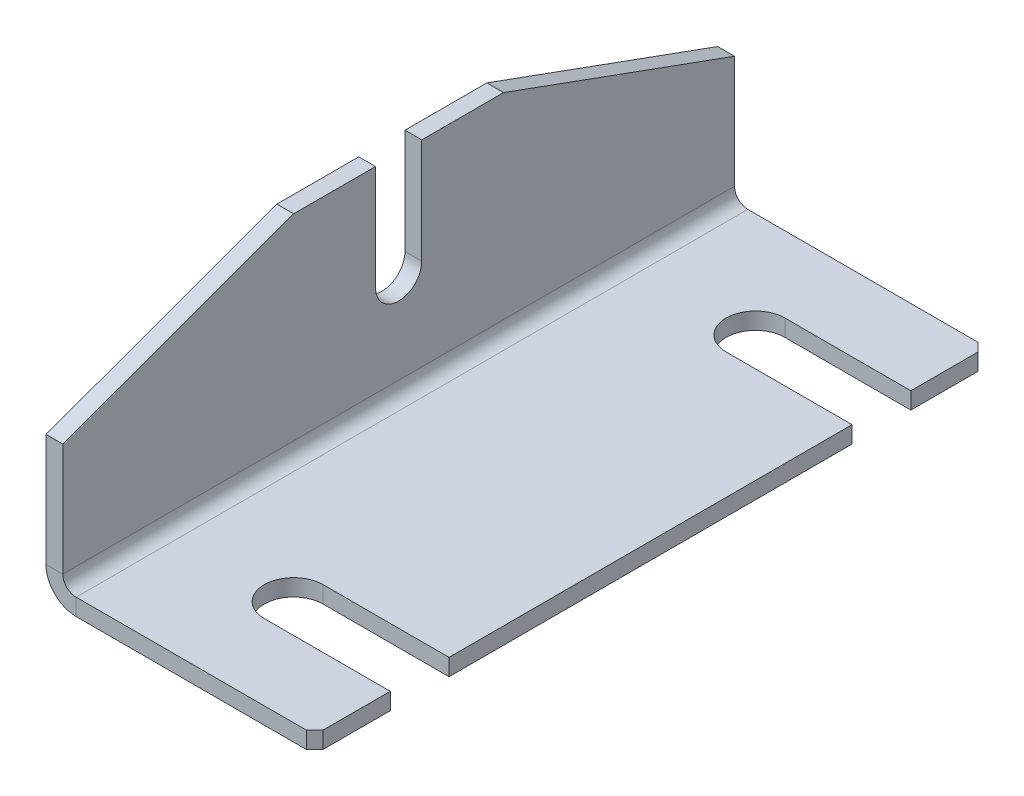
ISO-10303-21;
HEADER;
FILE_DESCRIPTION(('STEP AP214'),'2;1');
FILE_NAME('part.step','',(''),(''),'','','');
FILE_SCHEMA(('AUTOMOTIVE_DESIGN { 1 0 10303 214 1 1 1 1 }'));
ENDSEC;
DATA;
#1=APPLICATION_CONTEXT('core data for automotive mechanical design processes');
#2=APPLICATION_PROTOCOL_DEFINITION('international standard','automotive_design',2000,#1);
#3=PRODUCT_CONTEXT('',#1,'mechanical');
#4=PRODUCT('Part','Part','',(#3));
#5=PRODUCT_RELATED_PRODUCT_CATEGORY('part','',(#4));
#6=PRODUCT_DEFINITION_FORMATION('','',#4);
#7=PRODUCT_DEFINITION_CONTEXT('part definition',#1,'design');
#8=PRODUCT_DEFINITION('design','',#6,#7);
#9=PRODUCT_DEFINITION_SHAPE('','',#8);
#10=(LENGTH_UNIT() NAMED_UNIT(*) SI_UNIT(.MILLI.,.METRE.));
#11=(NAMED_UNIT(*) PLANE_ANGLE_UNIT() SI_UNIT($,.RADIAN.));
#12=(NAMED_UNIT(*) SI_UNIT($,.STERADIAN.) SOLID_ANGLE_UNIT());
#13=UNCERTAINTY_MEASURE_WITH_UNIT(LENGTH_MEASURE(1.E-05),#10,'distance_accuracy_value','');
#14=(GEOMETRIC_REPRESENTATION_CONTEXT(3) GLOBAL_UNCERTAINTY_ASSIGNED_CONTEXT((#13)) GLOBAL_UNIT_ASSIGNED_CONTEXT((#10,
#11,#12)) REPRESENTATION_CONTEXT('',''));
#15=CARTESIAN_POINT('',(0.,0.,0.));
#16=DIRECTION('',(0.,0.,1.));
#17=DIRECTION('',(1.,0.,0.));
#18=AXIS2_PLACEMENT_3D('',#15,#16,#17);
#19=CARTESIAN_POINT('',(60.,0.,80.));
#20=DIRECTION('',(1.,0.,0.));
#21=DIRECTION('',(0.,0.,-1.));
#22=AXIS2_PLACEMENT_3D('',#19,#20,#21);
#23=PLANE('',#22);
#24=DIRECTION('',(0.,0.,-1.));
#25=VECTOR('',#24,1.);
#26=CARTESIAN_POINT('',(60.,-4.,80.));
#27=LINE('',#26,#25);
#28=CARTESIAN_POINT('',(60.,-4.,-62.));
#29=VERTEX_POINT('',#28);
#30=CARTESIAN_POINT('',(60.,-4.,-78.));
#31=VERTEX_POINT('',#30);
#32=EDGE_CURVE('E359',#29,#31,#27,.T.);
#33=ORIENTED_EDGE('',*,*,#32,.T.);
#34=DIRECTION('',(0.,1.,0.));
#35=VECTOR('',#34,1.);
#36=CARTESIAN_POINT('',(60.,0.,-78.));
#37=LINE('',#36,#35);
#38=CARTESIAN_POINT('',(60.,0.,-78.));
#39=VERTEX_POINT('',#38);
#40=EDGE_CURVE('E381',#31,#39,#37,.T.);
#41=ORIENTED_EDGE('',*,*,#40,.T.);
#42=DIRECTION('',(0.,0.,-1.));
#43=VECTOR('',#42,1.);
#44=CARTESIAN_POINT('',(60.,0.,80.));
#45=LINE('',#44,#43);
#46=CARTESIAN_POINT('',(60.,0.,-62.));
#47=VERTEX_POINT('',#46);
#48=EDGE_CURVE('E356',#47,#39,#45,.T.);
#49=ORIENTED_EDGE('',*,*,#48,.F.);
#50=DIRECTION('',(0.,1.,0.));
#51=VECTOR('',#50,1.);
#52=CARTESIAN_POINT('',(60.,-4.001,-62.));
#53=LINE('',#52,#51);
#54=EDGE_CURVE('E240',#29,#47,#53,.T.);
#55=ORIENTED_EDGE('',*,*,#54,.F.);
#56=EDGE_LOOP('',(#33,#41,#49,#55));
#57=FACE_BOUND('',#56,.T.);
#58=ADVANCED_FACE('F38',(#57),#23,.T.);
#59=DIRECTION('',(0.,1.,0.));
#60=VECTOR('',#59,1.);
#61=CARTESIAN_POINT('',(60.,-4.001,-48.));
#62=LINE('',#61,#60);
#63=CARTESIAN_POINT('',(60.,-4.,-48.));
#64=VERTEX_POINT('',#63);
#65=CARTESIAN_POINT('',(60.,0.,-48.));
#66=VERTEX_POINT('',#65);
#67=EDGE_CURVE('E210',#64,#66,#62,.T.);
#68=ORIENTED_EDGE('',*,*,#67,.T.);
#69=CARTESIAN_POINT('',(60.,0.,48.));
#70=VERTEX_POINT('',#69);
#71=EDGE_CURVE('E360',#70,#66,#45,.T.);
#72=ORIENTED_EDGE('',*,*,#71,.F.);
#73=DIRECTION('',(0.,1.,0.));
#74=VECTOR('',#73,1.);
#75=CARTESIAN_POINT('',(60.,-4.001,48.));
#76=LINE('',#75,#74);
#77=CARTESIAN_POINT('',(60.,-4.,48.));
#78=VERTEX_POINT('',#77);
#79=EDGE_CURVE('E258',#78,#70,#76,.T.);
#80=ORIENTED_EDGE('',*,*,#79,.F.);
#81=EDGE_CURVE('E364',#78,#64,#27,.T.);
#82=ORIENTED_EDGE('',*,*,#81,.T.);
#83=EDGE_LOOP('',(#68,#72,#80,#82));
#84=FACE_BOUND('',#83,.T.);
#85=ADVANCED_FACE('F411',(#84),#23,.T.);
#86=CARTESIAN_POINT('',(-4.,50.,80.));
#87=DIRECTION('',(0.,1.,0.));
#88=DIRECTION('',(0.,0.,1.));
#89=AXIS2_PLACEMENT_3D('',#86,#87,#88);
#90=PLANE('',#89);
#91=DIRECTION('',(1.,0.,0.));
#92=VECTOR('',#91,1.);
#93=CARTESIAN_POINT('',(-4.001,50.,25.));
#94=LINE('',#93,#92);
#95=CARTESIAN_POINT('',(-4.,50.,25.));
#96=VERTEX_POINT('',#95);
#97=CARTESIAN_POINT('',(0.,50.,25.));
#98=VERTEX_POINT('',#97);
#99=EDGE_CURVE('E269',#96,#98,#94,.T.);
#100=ORIENTED_EDGE('',*,*,#99,.T.);
#101=DIRECTION('',(0.,0.,-1.));
#102=VECTOR('',#101,1.);
#103=CARTESIAN_POINT('',(0.,50.,80.));
#104=LINE('',#103,#102);
#105=CARTESIAN_POINT('',(0.,50.,5.50000000000001));
#106=VERTEX_POINT('',#105);
#107=EDGE_CURVE('E348',#98,#106,#104,.T.);
#108=ORIENTED_EDGE('',*,*,#107,.T.);
#109=DIRECTION('',(1.,0.,0.));
#110=VECTOR('',#109,1.);
#111=CARTESIAN_POINT('',(-4.001,50.,5.50000000000001));
#112=LINE('',#111,#110);
#113=CARTESIAN_POINT('',(-4.,50.,5.50000000000001));
#114=VERTEX_POINT('',#113);
#115=EDGE_CURVE('E300',#114,#106,#112,.T.);
#116=ORIENTED_EDGE('',*,*,#115,.F.);
#117=DIRECTION('',(0.,0.,-1.));
#118=VECTOR('',#117,1.);
#119=CARTESIAN_POINT('',(-4.,50.,80.));
#120=LINE('',#119,#118);
#121=EDGE_CURVE('E345',#96,#114,#120,.T.);
#122=ORIENTED_EDGE('',*,*,#121,.F.);
#123=EDGE_LOOP('',(#100,#108,#116,#122));
#124=FACE_BOUND('',#123,.T.);
#125=ADVANCED_FACE('F487',(#124),#90,.T.);
#126=CARTESIAN_POINT('',(3.175,0.,80.));
#127=DIRECTION('',(0.,0.,1.));
#128=DIRECTION('',(1.,0.,0.));
#129=AXIS2_PLACEMENT_3D('',#126,#127,#128);
#130=PLANE('',#129);
#131=DIRECTION('',(0.,-1.,0.));
#132=VECTOR('',#131,1.);
#133=CARTESIAN_POINT('',(3.175,0.,80.));
#134=LINE('',#133,#132);
#135=CARTESIAN_POINT('',(3.175,0.,80.));
#136=VERTEX_POINT('',#135);
#137=CARTESIAN_POINT('',(3.175,-4.,80.));
#138=VERTEX_POINT('',#137);
#139=EDGE_CURVE('E372',#136,#138,#134,.T.);
#140=ORIENTED_EDGE('',*,*,#139,.F.);
#141=CARTESIAN_POINT('',(3.175,3.175,80.));
#142=DIRECTION('',(0.,0.,-1.));
#143=DIRECTION('',(-1.,0.,0.));
#144=AXIS2_PLACEMENT_3D('',#141,#142,#143);
#145=CIRCLE('',#144,3.175);
#146=CARTESIAN_POINT('',(0.,3.175,80.));
#147=VERTEX_POINT('',#146);
#148=EDGE_CURVE('E315',#147,#136,#145,.F.);
#149=ORIENTED_EDGE('',*,*,#148,.F.);
#150=DIRECTION('',(1.,0.,0.));
#151=VECTOR('',#150,1.);
#152=CARTESIAN_POINT('',(-4.,3.175,80.));
#153=LINE('',#152,#151);
#154=CARTESIAN_POINT('',(-4.,3.175,80.));
#155=VERTEX_POINT('',#154);
#156=EDGE_CURVE('E369',#155,#147,#153,.T.);
#157=ORIENTED_EDGE('',*,*,#156,.F.);
#158=CARTESIAN_POINT('',(3.175,3.175,80.));
#159=DIRECTION('',(0.,0.,1.));
#160=DIRECTION('',(1.,0.,0.));
#161=AXIS2_PLACEMENT_3D('',#158,#159,#160);
#162=CIRCLE('',#161,7.175);
#163=EDGE_CURVE('E322',#155,#138,#162,.T.);
#164=ORIENTED_EDGE('',*,*,#163,.T.);
#165=EDGE_LOOP('',(#140,#149,#157,#164));
#166=FACE_BOUND('',#165,.T.);
#167=ADVANCED_FACE('F439',(#166),#130,.T.);
#168=CARTESIAN_POINT('',(-4.,3.175,80.));
#169=DIRECTION('',(0.,0.,1.));
#170=DIRECTION('',(1.,0.,0.));
#171=AXIS2_PLACEMENT_3D('',#168,#169,#170);
#172=PLANE('',#171);
#173=DIRECTION('',(1.,0.,0.));
#174=VECTOR('',#173,1.);
#175=CARTESIAN_POINT('',(0.,-4.,80.));
#176=LINE('',#175,#174);
#177=CARTESIAN_POINT('',(58.,-4.,80.));
#178=VERTEX_POINT('',#177);
#179=EDGE_CURVE('E310',#138,#178,#176,.T.);
#180=ORIENTED_EDGE('',*,*,#179,.T.);
#181=DIRECTION('',(0.,1.,0.));
#182=VECTOR('',#181,1.);
#183=CARTESIAN_POINT('',(58.,3.175,80.));
#184=LINE('',#183,#182);
#185=CARTESIAN_POINT('',(58.,0.,80.));
#186=VERTEX_POINT('',#185);
#187=EDGE_CURVE('E11',#178,#186,#184,.T.);
#188=ORIENTED_EDGE('',*,*,#187,.T.);
#189=DIRECTION('',(1.,0.,0.));
#190=VECTOR('',#189,1.);
#191=CARTESIAN_POINT('',(0.,0.,80.));
#192=LINE('',#191,#190);
#193=EDGE_CURVE('E312',#136,#186,#192,.T.);
#194=ORIENTED_EDGE('',*,*,#193,.F.);
#195=ORIENTED_EDGE('',*,*,#139,.T.);
#196=EDGE_LOOP('',(#180,#188,#194,#195));
#197=FACE_BOUND('',#196,.T.);
#198=ADVANCED_FACE('F434',(#197),#172,.T.);
#199=CARTESIAN_POINT('',(0.,3.175,-80.));
#200=DIRECTION('',(0.,0.,-1.));
#201=DIRECTION('',(-1.,0.,0.));
#202=AXIS2_PLACEMENT_3D('',#199,#200,#201);
#203=PLANE('',#202);
#204=DIRECTION('',(-1.,0.,0.));
#205=VECTOR('',#204,1.);
#206=CARTESIAN_POINT('',(0.,3.175,-80.));
#207=LINE('',#206,#205);
#208=CARTESIAN_POINT('',(0.,3.175,-80.));
#209=VERTEX_POINT('',#208);
#210=CARTESIAN_POINT('',(-4.,3.175,-80.));
#211=VERTEX_POINT('',#210);
#212=EDGE_CURVE('E366',#209,#211,#207,.T.);
#213=ORIENTED_EDGE('',*,*,#212,.F.);
#214=CARTESIAN_POINT('',(3.175,3.175,-80.));
#215=DIRECTION('',(0.,0.,-1.));
#216=DIRECTION('',(-1.,0.,0.));
#217=AXIS2_PLACEMENT_3D('',#214,#215,#216);
#218=CIRCLE('',#217,3.175);
#219=CARTESIAN_POINT('',(3.175,0.,-80.));
#220=VERTEX_POINT('',#219);
#221=EDGE_CURVE('E330',#209,#220,#218,.F.);
#222=ORIENTED_EDGE('',*,*,#221,.T.);
#223=DIRECTION('',(0.,1.,0.));
#224=VECTOR('',#223,1.);
#225=CARTESIAN_POINT('',(3.175,-4.,-80.));
#226=LINE('',#225,#224);
#227=CARTESIAN_POINT('',(3.175,-4.,-80.));
#228=VERTEX_POINT('',#227);
#229=EDGE_CURVE('E363',#228,#220,#226,.T.);
#230=ORIENTED_EDGE('',*,*,#229,.F.);
#231=CARTESIAN_POINT('',(3.175,3.175,-80.));
#232=DIRECTION('',(0.,0.,1.));
#233=DIRECTION('',(1.,0.,0.));
#234=AXIS2_PLACEMENT_3D('',#231,#232,#233);
#235=CIRCLE('',#234,7.175);
#236=EDGE_CURVE('E313',#211,#228,#235,.T.);
#237=ORIENTED_EDGE('',*,*,#236,.F.);
#238=EDGE_LOOP('',(#213,#222,#230,#237));
#239=FACE_BOUND('',#238,.T.);
#240=ADVANCED_FACE('F444',(#239),#203,.T.);
#241=CARTESIAN_POINT('',(3.175,-4.,-80.));
#242=DIRECTION('',(0.,0.,-1.));
#243=DIRECTION('',(-1.,0.,0.));
#244=AXIS2_PLACEMENT_3D('',#241,#242,#243);
#245=PLANE('',#244);
#246=DIRECTION('',(1.,0.,0.));
#247=VECTOR('',#246,1.);
#248=CARTESIAN_POINT('',(-4.001,30.,-80.));
#249=LINE('',#248,#247);
#250=CARTESIAN_POINT('',(-4.,30.,-80.));
#251=VERTEX_POINT('',#250);
#252=CARTESIAN_POINT('',(0.,30.,-80.));
#253=VERTEX_POINT('',#252);
#254=EDGE_CURVE('E278',#251,#253,#249,.T.);
#255=ORIENTED_EDGE('',*,*,#254,.T.);
#256=DIRECTION('',(0.,-1.,0.));
#257=VECTOR('',#256,1.);
#258=CARTESIAN_POINT('',(0.,0.,-80.));
#259=LINE('',#258,#257);
#260=EDGE_CURVE('E333',#253,#209,#259,.T.);
#261=ORIENTED_EDGE('',*,*,#260,.T.);
#262=ORIENTED_EDGE('',*,*,#212,.T.);
#263=DIRECTION('',(0.,1.,0.));
#264=VECTOR('',#263,1.);
#265=CARTESIAN_POINT('',(-4.,0.,-80.));
#266=LINE('',#265,#264);
#267=EDGE_CURVE('E335',#251,#211,#266,.F.);
#268=ORIENTED_EDGE('',*,*,#267,.F.);
#269=EDGE_LOOP('',(#255,#261,#262,#268));
#270=FACE_BOUND('',#269,.T.);
#271=ADVANCED_FACE('F464',(#270),#245,.T.);
#272=CARTESIAN_POINT('',(0.,-4.,80.));
#273=DIRECTION('',(0.,1.,0.));
#274=DIRECTION('',(0.,0.,1.));
#275=AXIS2_PLACEMENT_3D('',#272,#273,#274);
#276=PLANE('',#275);
#277=DIRECTION('',(1.,0.,0.));
#278=VECTOR('',#277,1.);
#279=CARTESIAN_POINT('',(0.,-4.,-80.));
#280=LINE('',#279,#278);
#281=CARTESIAN_POINT('',(58.,-4.,-80.));
#282=VERTEX_POINT('',#281);
#283=EDGE_CURVE('E309',#228,#282,#280,.T.);
#284=ORIENTED_EDGE('',*,*,#283,.T.);
#285=DIRECTION('',(-0.707106781186548,0.,-0.707106781186548));
#286=VECTOR('',#285,1.);
#287=CARTESIAN_POINT('',(58.,-4.,-80.));
#288=LINE('',#287,#286);
#289=EDGE_CURVE('E379',#282,#31,#288,.F.);
#290=ORIENTED_EDGE('',*,*,#289,.T.);
#291=ORIENTED_EDGE('',*,*,#32,.F.);
#292=DIRECTION('',(1.,0.,0.));
#293=VECTOR('',#292,1.);
#294=CARTESIAN_POINT('',(30.,-4.,-62.));
#295=LINE('',#294,#293);
#296=CARTESIAN_POINT('',(30.,-4.,-62.));
#297=VERTEX_POINT('',#296);
#298=EDGE_CURVE('E226',#297,#29,#295,.T.);
#299=ORIENTED_EDGE('',*,*,#298,.F.);
#300=CARTESIAN_POINT('',(30.,-4.,-55.));
#301=DIRECTION('',(0.,1.,0.));
#302=DIRECTION('',(0.,0.,1.));
#303=AXIS2_PLACEMENT_3D('',#300,#301,#302);
#304=CIRCLE('',#303,7.00000000000001);
#305=CARTESIAN_POINT('',(30.,-4.,-48.));
#306=VERTEX_POINT('',#305);
#307=EDGE_CURVE('E204',#306,#297,#304,.F.);
#308=ORIENTED_EDGE('',*,*,#307,.F.);
#309=DIRECTION('',(-1.,0.,0.));
#310=VECTOR('',#309,1.);
#311=CARTESIAN_POINT('',(30.,-4.,-48.));
#312=LINE('',#311,#310);
#313=EDGE_CURVE('E214',#64,#306,#312,.T.);
#314=ORIENTED_EDGE('',*,*,#313,.F.);
#315=ORIENTED_EDGE('',*,*,#81,.F.);
#316=DIRECTION('',(1.,0.,0.));
#317=VECTOR('',#316,1.);
#318=CARTESIAN_POINT('',(30.,-4.,48.));
#319=LINE('',#318,#317);
#320=CARTESIAN_POINT('',(30.,-4.,48.));
#321=VERTEX_POINT('',#320);
#322=EDGE_CURVE('E246',#321,#78,#319,.T.);
#323=ORIENTED_EDGE('',*,*,#322,.F.);
#324=CARTESIAN_POINT('',(30.,-4.,55.));
#325=DIRECTION('',(0.,1.,0.));
#326=DIRECTION('',(0.,0.,1.));
#327=AXIS2_PLACEMENT_3D('',#324,#325,#326);
#328=CIRCLE('',#327,7.);
#329=CARTESIAN_POINT('',(30.,-4.,62.));
#330=VERTEX_POINT('',#329);
#331=EDGE_CURVE('E243',#330,#321,#328,.F.);
#332=ORIENTED_EDGE('',*,*,#331,.F.);
#333=DIRECTION('',(-1.,0.,0.));
#334=VECTOR('',#333,1.);
#335=CARTESIAN_POINT('',(30.,-4.,62.));
#336=LINE('',#335,#334);
#337=CARTESIAN_POINT('',(60.,-4.,62.));
#338=VERTEX_POINT('',#337);
#339=EDGE_CURVE('E227',#338,#330,#336,.T.);
#340=ORIENTED_EDGE('',*,*,#339,.F.);
#341=CARTESIAN_POINT('',(60.,-4.,78.));
#342=VERTEX_POINT('',#341);
#343=EDGE_CURVE('E361',#342,#338,#27,.T.);
#344=ORIENTED_EDGE('',*,*,#343,.F.);
#345=DIRECTION('',(0.707106781186548,0.,-0.707106781186548));
#346=VECTOR('',#345,1.);
#347=CARTESIAN_POINT('',(60.,-4.,78.));
#348=LINE('',#347,#346);
#349=EDGE_CURVE('E377',#342,#178,#348,.F.);
#350=ORIENTED_EDGE('',*,*,#349,.T.);
#351=ORIENTED_EDGE('',*,*,#179,.F.);
#352=DIRECTION('',(0.,0.,-1.));
#353=VECTOR('',#352,1.);
#354=CARTESIAN_POINT('',(3.175,-4.,80.));
#355=LINE('',#354,#353);
#356=EDGE_CURVE('E325',#138,#228,#355,.T.);
#357=ORIENTED_EDGE('',*,*,#356,.T.);
#358=EDGE_LOOP('',(#284,#290,#291,#299,#308,#314,#315,#323,#332,#340,#344,#350,#351,#357));
#359=FACE_BOUND('',#358,.T.);
#360=ADVANCED_FACE('F224',(#359),#276,.F.);
#361=CARTESIAN_POINT('',(60.,0.,78.));
#362=VERTEX_POINT('',#361);
#363=CARTESIAN_POINT('',(60.,0.,62.));
#364=VERTEX_POINT('',#363);
#365=EDGE_CURVE('E357',#362,#364,#45,.T.);
#366=ORIENTED_EDGE('',*,*,#365,.F.);
#367=DIRECTION('',(0.,-1.,0.));
#368=VECTOR('',#367,1.);
#369=CARTESIAN_POINT('',(60.,0.,78.));
#370=LINE('',#369,#368);
#371=EDGE_CURVE('E47',#362,#342,#370,.T.);
#372=ORIENTED_EDGE('',*,*,#371,.T.);
#373=ORIENTED_EDGE('',*,*,#343,.T.);
#374=DIRECTION('',(0.,1.,0.));
#375=VECTOR('',#374,1.);
#376=CARTESIAN_POINT('',(60.,-4.001,62.));
#377=LINE('',#376,#375);
#378=EDGE_CURVE('E260',#338,#364,#377,.T.);
#379=ORIENTED_EDGE('',*,*,#378,.T.);
#380=EDGE_LOOP('',(#366,#372,#373,#379));
#381=FACE_BOUND('',#380,.T.);
#382=ADVANCED_FACE('F389',(#381),#23,.T.);
#383=CARTESIAN_POINT('',(0.,0.,80.));
#384=DIRECTION('',(0.,1.,0.));
#385=DIRECTION('',(0.,0.,1.));
#386=AXIS2_PLACEMENT_3D('',#383,#384,#385);
#387=PLANE('',#386);
#388=ORIENTED_EDGE('',*,*,#48,.T.);
#389=DIRECTION('',(0.707106781186548,0.,0.707106781186548));
#390=VECTOR('',#389,1.);
#391=CARTESIAN_POINT('',(109.,0.,-29.));
#392=LINE('',#391,#390);
#393=CARTESIAN_POINT('',(58.,0.,-80.));
#394=VERTEX_POINT('',#393);
#395=EDGE_CURVE('E384',#39,#394,#392,.F.);
#396=ORIENTED_EDGE('',*,*,#395,.T.);
#397=DIRECTION('',(1.,0.,0.));
#398=VECTOR('',#397,1.);
#399=CARTESIAN_POINT('',(0.,0.,-80.));
#400=LINE('',#399,#398);
#401=EDGE_CURVE('E327',#220,#394,#400,.T.);
#402=ORIENTED_EDGE('',*,*,#401,.F.);
#403=DIRECTION('',(0.,0.,-1.));
#404=VECTOR('',#403,1.);
#405=CARTESIAN_POINT('',(3.175,0.,80.));
#406=LINE('',#405,#404);
#407=EDGE_CURVE('E353',#136,#220,#406,.T.);
#408=ORIENTED_EDGE('',*,*,#407,.F.);
#409=ORIENTED_EDGE('',*,*,#193,.T.);
#410=DIRECTION('',(-0.707106781186548,0.,0.707106781186548));
#411=VECTOR('',#410,1.);
#412=CARTESIAN_POINT('',(29.,0.,109.));
#413=LINE('',#412,#411);
#414=EDGE_CURVE('E54',#186,#362,#413,.F.);
#415=ORIENTED_EDGE('',*,*,#414,.T.);
#416=ORIENTED_EDGE('',*,*,#365,.T.);
#417=DIRECTION('',(1.,0.,0.));
#418=VECTOR('',#417,1.);
#419=CARTESIAN_POINT('',(30.,0.,62.));
#420=LINE('',#419,#418);
#421=CARTESIAN_POINT('',(30.,0.,62.));
#422=VERTEX_POINT('',#421);
#423=EDGE_CURVE('E250',#422,#364,#420,.T.);
#424=ORIENTED_EDGE('',*,*,#423,.F.);
#425=CARTESIAN_POINT('',(30.,0.,55.));
#426=DIRECTION('',(0.,1.,0.));
#427=DIRECTION('',(0.,0.,1.));
#428=AXIS2_PLACEMENT_3D('',#425,#426,#427);
#429=CIRCLE('',#428,7.);
#430=CARTESIAN_POINT('',(30.,0.,48.));
#431=VERTEX_POINT('',#430);
#432=EDGE_CURVE('E248',#431,#422,#429,.T.);
#433=ORIENTED_EDGE('',*,*,#432,.F.);
#434=DIRECTION('',(-1.,0.,0.));
#435=VECTOR('',#434,1.);
#436=CARTESIAN_POINT('',(30.,0.,48.));
#437=LINE('',#436,#435);
#438=EDGE_CURVE('E253',#70,#431,#437,.T.);
#439=ORIENTED_EDGE('',*,*,#438,.F.);
#440=ORIENTED_EDGE('',*,*,#71,.T.);
#441=DIRECTION('',(1.,0.,0.));
#442=VECTOR('',#441,1.);
#443=CARTESIAN_POINT('',(30.,0.,-48.));
#444=LINE('',#443,#442);
#445=CARTESIAN_POINT('',(30.,0.,-48.));
#446=VERTEX_POINT('',#445);
#447=EDGE_CURVE('E235',#446,#66,#444,.T.);
#448=ORIENTED_EDGE('',*,*,#447,.F.);
#449=CARTESIAN_POINT('',(30.,0.,-55.));
#450=DIRECTION('',(0.,1.,0.));
#451=DIRECTION('',(0.,0.,1.));
#452=AXIS2_PLACEMENT_3D('',#449,#450,#451);
#453=CIRCLE('',#452,7.00000000000001);
#454=CARTESIAN_POINT('',(30.,0.,-62.));
#455=VERTEX_POINT('',#454);
#456=EDGE_CURVE('E207',#455,#446,#453,.T.);
#457=ORIENTED_EDGE('',*,*,#456,.F.);
#458=DIRECTION('',(-1.,0.,0.));
#459=VECTOR('',#458,1.);
#460=CARTESIAN_POINT('',(30.,0.,-62.));
#461=LINE('',#460,#459);
#462=EDGE_CURVE('E211',#47,#455,#461,.T.);
#463=ORIENTED_EDGE('',*,*,#462,.F.);
#464=EDGE_LOOP('',(#388,#396,#402,#408,#409,#415,#416,#424,#433,#439,#440,#448,#457,#463));
#465=FACE_BOUND('',#464,.T.);
#466=ADVANCED_FACE('F401',(#465),#387,.T.);
#467=CARTESIAN_POINT('',(3.175,3.175,80.));
#468=DIRECTION('',(0.,0.,-1.));
#469=DIRECTION('',(-1.,0.,0.));
#470=AXIS2_PLACEMENT_3D('',#467,#468,#469);
#471=CYLINDRICAL_SURFACE('',#470,3.175);
#472=ORIENTED_EDGE('',*,*,#221,.F.);
#473=DIRECTION('',(0.,0.,-1.));
#474=VECTOR('',#473,1.);
#475=CARTESIAN_POINT('',(0.,3.175,80.));
#476=LINE('',#475,#474);
#477=EDGE_CURVE('E350',#147,#209,#476,.T.);
#478=ORIENTED_EDGE('',*,*,#477,.F.);
#479=ORIENTED_EDGE('',*,*,#148,.T.);
#480=ORIENTED_EDGE('',*,*,#407,.T.);
#481=EDGE_LOOP('',(#472,#478,#479,#480));
#482=FACE_BOUND('',#481,.T.);
#483=ADVANCED_FACE('F431',(#482),#471,.F.);
#484=CARTESIAN_POINT('',(0.,0.,80.));
#485=DIRECTION('',(1.,0.,0.));
#486=DIRECTION('',(0.,0.,-1.));
#487=AXIS2_PLACEMENT_3D('',#484,#485,#486);
#488=PLANE('',#487);
#489=DIRECTION('',(0.,0.341743063086704,-0.939793423488437));
#490=VECTOR('',#489,1.);
#491=CARTESIAN_POINT('',(0.,30.,80.));
#492=LINE('',#491,#490);
#493=CARTESIAN_POINT('',(0.,30.,80.));
#494=VERTEX_POINT('',#493);
#495=EDGE_CURVE('E265',#494,#98,#492,.T.);
#496=ORIENTED_EDGE('',*,*,#495,.F.);
#497=DIRECTION('',(0.,-1.,0.));
#498=VECTOR('',#497,1.);
#499=CARTESIAN_POINT('',(0.,0.,80.));
#500=LINE('',#499,#498);
#501=EDGE_CURVE('E318',#494,#147,#500,.T.);
#502=ORIENTED_EDGE('',*,*,#501,.T.);
#503=ORIENTED_EDGE('',*,*,#477,.T.);
#504=ORIENTED_EDGE('',*,*,#260,.F.);
#505=DIRECTION('',(0.,-0.341743063086704,-0.939793423488437));
#506=VECTOR('',#505,1.);
#507=CARTESIAN_POINT('',(0.,50.,-25.));
#508=LINE('',#507,#506);
#509=CARTESIAN_POINT('',(0.,50.,-25.));
#510=VERTEX_POINT('',#509);
#511=EDGE_CURVE('E220',#510,#253,#508,.T.);
#512=ORIENTED_EDGE('',*,*,#511,.F.);
#513=CARTESIAN_POINT('',(0.,50.,-5.50000000000001));
#514=VERTEX_POINT('',#513);
#515=EDGE_CURVE('E347',#514,#510,#104,.T.);
#516=ORIENTED_EDGE('',*,*,#515,.F.);
#517=DIRECTION('',(0.,1.,0.));
#518=VECTOR('',#517,1.);
#519=CARTESIAN_POINT('',(0.,25.,-5.5));
#520=LINE('',#519,#518);
#521=CARTESIAN_POINT('',(0.,25.,-5.5));
#522=VERTEX_POINT('',#521);
#523=EDGE_CURVE('E291',#522,#514,#520,.T.);
#524=ORIENTED_EDGE('',*,*,#523,.F.);
#525=CARTESIAN_POINT('',(0.,25.,0.));
#526=DIRECTION('',(1.,0.,0.));
#527=DIRECTION('',(0.,0.,-1.));
#528=AXIS2_PLACEMENT_3D('',#525,#526,#527);
#529=CIRCLE('',#528,5.5);
#530=CARTESIAN_POINT('',(0.,25.,5.5));
#531=VERTEX_POINT('',#530);
#532=EDGE_CURVE('E288',#531,#522,#529,.T.);
#533=ORIENTED_EDGE('',*,*,#532,.F.);
#534=DIRECTION('',(0.,-1.,0.));
#535=VECTOR('',#534,1.);
#536=CARTESIAN_POINT('',(0.,25.,5.5));
#537=LINE('',#536,#535);
#538=EDGE_CURVE('E293',#106,#531,#537,.T.);
#539=ORIENTED_EDGE('',*,*,#538,.F.);
#540=ORIENTED_EDGE('',*,*,#107,.F.);
#541=EDGE_LOOP('',(#496,#502,#503,#504,#512,#516,#524,#533,#539,#540));
#542=FACE_BOUND('',#541,.T.);
#543=ADVANCED_FACE('F450',(#542),#488,.T.);
#544=DIRECTION('',(1.,0.,0.));
#545=VECTOR('',#544,1.);
#546=CARTESIAN_POINT('',(-4.001,50.,-25.));
#547=LINE('',#546,#545);
#548=CARTESIAN_POINT('',(-4.,50.,-24.9999999999999));
#549=VERTEX_POINT('',#548);
#550=EDGE_CURVE('E277',#549,#510,#547,.T.);
#551=ORIENTED_EDGE('',*,*,#550,.F.);
#552=CARTESIAN_POINT('',(-4.,50.,-5.50000000000002));
#553=VERTEX_POINT('',#552);
#554=EDGE_CURVE('E344',#553,#549,#120,.T.);
#555=ORIENTED_EDGE('',*,*,#554,.F.);
#556=DIRECTION('',(1.,0.,0.));
#557=VECTOR('',#556,1.);
#558=CARTESIAN_POINT('',(-4.001,50.,-5.50000000000001));
#559=LINE('',#558,#557);
#560=EDGE_CURVE('E303',#553,#514,#559,.T.);
#561=ORIENTED_EDGE('',*,*,#560,.T.);
#562=ORIENTED_EDGE('',*,*,#515,.T.);
#563=EDGE_LOOP('',(#551,#555,#561,#562));
#564=FACE_BOUND('',#563,.T.);
#565=ADVANCED_FACE('F472',(#564),#90,.T.);
#566=CARTESIAN_POINT('',(-4.,0.,80.));
#567=DIRECTION('',(1.,0.,0.));
#568=DIRECTION('',(0.,0.,-1.));
#569=AXIS2_PLACEMENT_3D('',#566,#567,#568);
#570=PLANE('',#569);
#571=DIRECTION('',(0.,1.,0.));
#572=VECTOR('',#571,1.);
#573=CARTESIAN_POINT('',(-4.,0.,80.));
#574=LINE('',#573,#572);
#575=CARTESIAN_POINT('',(-4.,30.,80.));
#576=VERTEX_POINT('',#575);
#577=EDGE_CURVE('E320',#576,#155,#574,.F.);
#578=ORIENTED_EDGE('',*,*,#577,.F.);
#579=DIRECTION('',(0.,-0.341743063086704,0.939793423488437));
#580=VECTOR('',#579,1.);
#581=CARTESIAN_POINT('',(-4.,30.,80.));
#582=LINE('',#581,#580);
#583=EDGE_CURVE('E272',#96,#576,#582,.T.);
#584=ORIENTED_EDGE('',*,*,#583,.F.);
#585=ORIENTED_EDGE('',*,*,#121,.T.);
#586=DIRECTION('',(0.,1.,0.));
#587=VECTOR('',#586,1.);
#588=CARTESIAN_POINT('',(-4.,25.,5.5));
#589=LINE('',#588,#587);
#590=CARTESIAN_POINT('',(-4.,25.,5.5));
#591=VERTEX_POINT('',#590);
#592=EDGE_CURVE('E285',#591,#114,#589,.T.);
#593=ORIENTED_EDGE('',*,*,#592,.F.);
#594=CARTESIAN_POINT('',(-4.,25.,0.));
#595=DIRECTION('',(1.,0.,0.));
#596=DIRECTION('',(0.,0.,-1.));
#597=AXIS2_PLACEMENT_3D('',#594,#595,#596);
#598=CIRCLE('',#597,5.5);
#599=CARTESIAN_POINT('',(-4.,25.,-5.5));
#600=VERTEX_POINT('',#599);
#601=EDGE_CURVE('E275',#600,#591,#598,.F.);
#602=ORIENTED_EDGE('',*,*,#601,.F.);
#603=DIRECTION('',(0.,-1.,0.));
#604=VECTOR('',#603,1.);
#605=CARTESIAN_POINT('',(-4.,25.,-5.5));
#606=LINE('',#605,#604);
#607=EDGE_CURVE('E299',#553,#600,#606,.T.);
#608=ORIENTED_EDGE('',*,*,#607,.F.);
#609=ORIENTED_EDGE('',*,*,#554,.T.);
#610=DIRECTION('',(0.,0.341743063086704,0.939793423488437));
#611=VECTOR('',#610,1.);
#612=CARTESIAN_POINT('',(-4.,50.,-25.));
#613=LINE('',#612,#611);
#614=EDGE_CURVE('E268',#251,#549,#613,.T.);
#615=ORIENTED_EDGE('',*,*,#614,.F.);
#616=ORIENTED_EDGE('',*,*,#267,.T.);
#617=DIRECTION('',(0.,0.,-1.));
#618=VECTOR('',#617,1.);
#619=CARTESIAN_POINT('',(-4.,3.175,80.));
#620=LINE('',#619,#618);
#621=EDGE_CURVE('E341',#155,#211,#620,.T.);
#622=ORIENTED_EDGE('',*,*,#621,.F.);
#623=EDGE_LOOP('',(#578,#584,#585,#593,#602,#608,#609,#615,#616,#622));
#624=FACE_BOUND('',#623,.T.);
#625=ADVANCED_FACE('F460',(#624),#570,.F.);
#626=CARTESIAN_POINT('',(3.175,3.175,80.));
#627=DIRECTION('',(0.,0.,-1.));
#628=DIRECTION('',(-1.,0.,0.));
#629=AXIS2_PLACEMENT_3D('',#626,#627,#628);
#630=CYLINDRICAL_SURFACE('',#629,7.175);
#631=ORIENTED_EDGE('',*,*,#236,.T.);
#632=ORIENTED_EDGE('',*,*,#356,.F.);
#633=ORIENTED_EDGE('',*,*,#163,.F.);
#634=ORIENTED_EDGE('',*,*,#621,.T.);
#635=EDGE_LOOP('',(#631,#632,#633,#634));
#636=FACE_BOUND('',#635,.T.);
#637=ADVANCED_FACE('F442',(#636),#630,.T.);
#638=CARTESIAN_POINT('',(3.175,3.175,80.));
#639=DIRECTION('',(0.,0.,-1.));
#640=DIRECTION('',(-1.,0.,0.));
#641=AXIS2_PLACEMENT_3D('',#638,#639,#640);
#642=PLANE('',#641);
#643=ORIENTED_EDGE('',*,*,#501,.F.);
#644=DIRECTION('',(1.,0.,0.));
#645=VECTOR('',#644,1.);
#646=CARTESIAN_POINT('',(-4.001,30.,80.));
#647=LINE('',#646,#645);
#648=EDGE_CURVE('E267',#576,#494,#647,.T.);
#649=ORIENTED_EDGE('',*,*,#648,.F.);
#650=ORIENTED_EDGE('',*,*,#577,.T.);
#651=ORIENTED_EDGE('',*,*,#156,.T.);
#652=EDGE_LOOP('',(#643,#649,#650,#651));
#653=FACE_BOUND('',#652,.T.);
#654=ADVANCED_FACE('F456',(#653),#642,.F.);
#655=CARTESIAN_POINT('',(3.175,3.175,-80.));
#656=DIRECTION('',(0.,0.,-1.));
#657=DIRECTION('',(-1.,0.,0.));
#658=AXIS2_PLACEMENT_3D('',#655,#656,#657);
#659=PLANE('',#658);
#660=ORIENTED_EDGE('',*,*,#401,.T.);
#661=DIRECTION('',(0.,-1.,0.));
#662=VECTOR('',#661,1.);
#663=CARTESIAN_POINT('',(58.,3.175,-80.));
#664=LINE('',#663,#662);
#665=EDGE_CURVE('E374',#394,#282,#664,.T.);
#666=ORIENTED_EDGE('',*,*,#665,.T.);
#667=ORIENTED_EDGE('',*,*,#283,.F.);
#668=ORIENTED_EDGE('',*,*,#229,.T.);
#669=EDGE_LOOP('',(#660,#666,#667,#668));
#670=FACE_BOUND('',#669,.T.);
#671=ADVANCED_FACE('F425',(#670),#659,.T.);
#672=CARTESIAN_POINT('',(-4.001,25.,0.));
#673=DIRECTION('',(1.,0.,0.));
#674=DIRECTION('',(0.,0.,-1.));
#675=AXIS2_PLACEMENT_3D('',#672,#673,#674);
#676=CYLINDRICAL_SURFACE('',#675,5.5);
#677=ORIENTED_EDGE('',*,*,#601,.T.);
#678=DIRECTION('',(1.,0.,0.));
#679=VECTOR('',#678,1.);
#680=CARTESIAN_POINT('',(-4.001,25.,5.5));
#681=LINE('',#680,#679);
#682=EDGE_CURVE('E297',#591,#531,#681,.T.);
#683=ORIENTED_EDGE('',*,*,#682,.T.);
#684=ORIENTED_EDGE('',*,*,#532,.T.);
#685=DIRECTION('',(1.,0.,0.));
#686=VECTOR('',#685,1.);
#687=CARTESIAN_POINT('',(-4.001,25.,-5.5));
#688=LINE('',#687,#686);
#689=EDGE_CURVE('E296',#600,#522,#688,.T.);
#690=ORIENTED_EDGE('',*,*,#689,.F.);
#691=EDGE_LOOP('',(#677,#683,#684,#690));
#692=FACE_BOUND('',#691,.T.);
#693=ADVANCED_FACE('F480',(#692),#676,.F.);
#694=CARTESIAN_POINT('',(-4.001,25.,5.5));
#695=DIRECTION('',(0.,0.,1.));
#696=DIRECTION('',(0.,-1.,0.));
#697=AXIS2_PLACEMENT_3D('',#694,#695,#696);
#698=PLANE('',#697);
#699=ORIENTED_EDGE('',*,*,#592,.T.);
#700=ORIENTED_EDGE('',*,*,#115,.T.);
#701=ORIENTED_EDGE('',*,*,#538,.T.);
#702=ORIENTED_EDGE('',*,*,#682,.F.);
#703=EDGE_LOOP('',(#699,#700,#701,#702));
#704=FACE_BOUND('',#703,.T.);
#705=ADVANCED_FACE('F484',(#704),#698,.F.);
#706=CARTESIAN_POINT('',(-4.001,25.,-5.5));
#707=DIRECTION('',(0.,0.,-1.));
#708=DIRECTION('',(0.,1.,0.));
#709=AXIS2_PLACEMENT_3D('',#706,#707,#708);
#710=PLANE('',#709);
#711=ORIENTED_EDGE('',*,*,#607,.T.);
#712=ORIENTED_EDGE('',*,*,#689,.T.);
#713=ORIENTED_EDGE('',*,*,#523,.T.);
#714=ORIENTED_EDGE('',*,*,#560,.F.);
#715=EDGE_LOOP('',(#711,#712,#713,#714));
#716=FACE_BOUND('',#715,.T.);
#717=ADVANCED_FACE('F476',(#716),#710,.F.);
#718=CARTESIAN_POINT('',(-4.001,30.,80.));
#719=DIRECTION('',(0.,-0.939793423488437,-0.341743063086704));
#720=DIRECTION('',(0.,0.341743063086704,-0.939793423488437));
#721=AXIS2_PLACEMENT_3D('',#718,#719,#720);
#722=PLANE('',#721);
#723=ORIENTED_EDGE('',*,*,#583,.T.);
#724=ORIENTED_EDGE('',*,*,#648,.T.);
#725=ORIENTED_EDGE('',*,*,#495,.T.);
#726=ORIENTED_EDGE('',*,*,#99,.F.);
#727=EDGE_LOOP('',(#723,#724,#725,#726));
#728=FACE_BOUND('',#727,.T.);
#729=ADVANCED_FACE('F489',(#728),#722,.F.);
#730=CARTESIAN_POINT('',(-4.001,50.,-25.));
#731=DIRECTION('',(0.,-0.939793423488437,0.341743063086704));
#732=DIRECTION('',(0.,-0.341743063086704,-0.939793423488437));
#733=AXIS2_PLACEMENT_3D('',#730,#731,#732);
#734=PLANE('',#733);
#735=ORIENTED_EDGE('',*,*,#614,.T.);
#736=ORIENTED_EDGE('',*,*,#550,.T.);
#737=ORIENTED_EDGE('',*,*,#511,.T.);
#738=ORIENTED_EDGE('',*,*,#254,.F.);
#739=EDGE_LOOP('',(#735,#736,#737,#738));
#740=FACE_BOUND('',#739,.T.);
#741=ADVANCED_FACE('F466',(#740),#734,.F.);
#742=CARTESIAN_POINT('',(30.,-4.001,55.));
#743=DIRECTION('',(0.,1.,0.));
#744=DIRECTION('',(0.,0.,1.));
#745=AXIS2_PLACEMENT_3D('',#742,#743,#744);
#746=CYLINDRICAL_SURFACE('',#745,7.);
#747=ORIENTED_EDGE('',*,*,#331,.T.);
#748=DIRECTION('',(0.,1.,0.));
#749=VECTOR('',#748,1.);
#750=CARTESIAN_POINT('',(30.,-4.001,48.));
#751=LINE('',#750,#749);
#752=EDGE_CURVE('E231',#321,#431,#751,.T.);
#753=ORIENTED_EDGE('',*,*,#752,.T.);
#754=ORIENTED_EDGE('',*,*,#432,.T.);
#755=DIRECTION('',(0.,1.,0.));
#756=VECTOR('',#755,1.);
#757=CARTESIAN_POINT('',(30.,-4.001,62.));
#758=LINE('',#757,#756);
#759=EDGE_CURVE('E256',#330,#422,#758,.T.);
#760=ORIENTED_EDGE('',*,*,#759,.F.);
#761=EDGE_LOOP('',(#747,#753,#754,#760));
#762=FACE_BOUND('',#761,.T.);
#763=ADVANCED_FACE('F406',(#762),#746,.F.);
#764=CARTESIAN_POINT('',(30.,-4.001,48.));
#765=DIRECTION('',(0.,0.,-1.));
#766=DIRECTION('',(-1.,0.,0.));
#767=AXIS2_PLACEMENT_3D('',#764,#765,#766);
#768=PLANE('',#767);
#769=ORIENTED_EDGE('',*,*,#322,.T.);
#770=ORIENTED_EDGE('',*,*,#79,.T.);
#771=ORIENTED_EDGE('',*,*,#438,.T.);
#772=ORIENTED_EDGE('',*,*,#752,.F.);
#773=EDGE_LOOP('',(#769,#770,#771,#772));
#774=FACE_BOUND('',#773,.T.);
#775=ADVANCED_FACE('F408',(#774),#768,.F.);
#776=CARTESIAN_POINT('',(30.,-4.001,62.));
#777=DIRECTION('',(0.,0.,1.));
#778=DIRECTION('',(1.,0.,0.));
#779=AXIS2_PLACEMENT_3D('',#776,#777,#778);
#780=PLANE('',#779);
#781=ORIENTED_EDGE('',*,*,#339,.T.);
#782=ORIENTED_EDGE('',*,*,#759,.T.);
#783=ORIENTED_EDGE('',*,*,#423,.T.);
#784=ORIENTED_EDGE('',*,*,#378,.F.);
#785=EDGE_LOOP('',(#781,#782,#783,#784));
#786=FACE_BOUND('',#785,.T.);
#787=ADVANCED_FACE('F397',(#786),#780,.F.);
#788=CARTESIAN_POINT('',(30.,-4.001,-55.));
#789=DIRECTION('',(0.,1.,0.));
#790=DIRECTION('',(0.,0.,1.));
#791=AXIS2_PLACEMENT_3D('',#788,#789,#790);
#792=CYLINDRICAL_SURFACE('',#791,7.00000000000001);
#793=ORIENTED_EDGE('',*,*,#307,.T.);
#794=DIRECTION('',(0.,1.,0.));
#795=VECTOR('',#794,1.);
#796=CARTESIAN_POINT('',(30.,-4.001,-62.));
#797=LINE('',#796,#795);
#798=EDGE_CURVE('E221',#297,#455,#797,.T.);
#799=ORIENTED_EDGE('',*,*,#798,.T.);
#800=ORIENTED_EDGE('',*,*,#456,.T.);
#801=DIRECTION('',(0.,1.,0.));
#802=VECTOR('',#801,1.);
#803=CARTESIAN_POINT('',(30.,-4.001,-48.));
#804=LINE('',#803,#802);
#805=EDGE_CURVE('E200',#306,#446,#804,.T.);
#806=ORIENTED_EDGE('',*,*,#805,.F.);
#807=EDGE_LOOP('',(#793,#799,#800,#806));
#808=FACE_BOUND('',#807,.T.);
#809=ADVANCED_FACE('F202',(#808),#792,.F.);
#810=CARTESIAN_POINT('',(30.,-4.001,-62.));
#811=DIRECTION('',(0.,0.,-1.));
#812=DIRECTION('',(-1.,0.,0.));
#813=AXIS2_PLACEMENT_3D('',#810,#811,#812);
#814=PLANE('',#813);
#815=ORIENTED_EDGE('',*,*,#298,.T.);
#816=ORIENTED_EDGE('',*,*,#54,.T.);
#817=ORIENTED_EDGE('',*,*,#462,.T.);
#818=ORIENTED_EDGE('',*,*,#798,.F.);
#819=EDGE_LOOP('',(#815,#816,#817,#818));
#820=FACE_BOUND('',#819,.T.);
#821=ADVANCED_FACE('F529',(#820),#814,.F.);
#822=CARTESIAN_POINT('',(30.,-4.001,-48.));
#823=DIRECTION('',(0.,0.,1.));
#824=DIRECTION('',(1.,0.,0.));
#825=AXIS2_PLACEMENT_3D('',#822,#823,#824);
#826=PLANE('',#825);
#827=ORIENTED_EDGE('',*,*,#313,.T.);
#828=ORIENTED_EDGE('',*,*,#805,.T.);
#829=ORIENTED_EDGE('',*,*,#447,.T.);
#830=ORIENTED_EDGE('',*,*,#67,.F.);
#831=EDGE_LOOP('',(#827,#828,#829,#830));
#832=FACE_BOUND('',#831,.T.);
#833=ADVANCED_FACE('F215',(#832),#826,.F.);
#834=CARTESIAN_POINT('',(58.,3.175,-80.));
#835=DIRECTION('',(-0.707106781186547,0.,0.707106781186547));
#836=DIRECTION('',(0.,-1.,0.));
#837=AXIS2_PLACEMENT_3D('',#834,#835,#836);
#838=PLANE('',#837);
#839=ORIENTED_EDGE('',*,*,#395,.F.);
#840=ORIENTED_EDGE('',*,*,#40,.F.);
#841=ORIENTED_EDGE('',*,*,#289,.F.);
#842=ORIENTED_EDGE('',*,*,#665,.F.);
#843=EDGE_LOOP('',(#839,#840,#841,#842));
#844=FACE_BOUND('',#843,.T.);
#845=ADVANCED_FACE('F419',(#844),#838,.F.);
#846=CARTESIAN_POINT('',(60.,0.,78.));
#847=DIRECTION('',(-0.707106781186547,0.,-0.707106781186547));
#848=DIRECTION('',(0.,-1.,0.));
#849=AXIS2_PLACEMENT_3D('',#846,#847,#848);
#850=PLANE('',#849);
#851=ORIENTED_EDGE('',*,*,#414,.F.);
#852=ORIENTED_EDGE('',*,*,#187,.F.);
#853=ORIENTED_EDGE('',*,*,#349,.F.);
#854=ORIENTED_EDGE('',*,*,#371,.F.);
#855=EDGE_LOOP('',(#851,#852,#853,#854));
#856=FACE_BOUND('',#855,.T.);
#857=ADVANCED_FACE('F41',(#856),#850,.F.);
#858=CLOSED_SHELL('',(#58,#85,#125,#167,#198,#240,#271,#360,#382,#466,#483,#543,#565,#625,#637,
#654,#671,#693,#705,#717,#729,#741,#763,#775,#787,#809,#821,#833,#845,#857));
#859=MANIFOLD_SOLID_BREP('B2',#858);
#860=ADVANCED_BREP_SHAPE_REPRESENTATION('',(#18,#859),#14);
#861=SHAPE_DEFINITION_REPRESENTATION(#9,#860);
ENDSEC;
END-ISO-10303-21;
